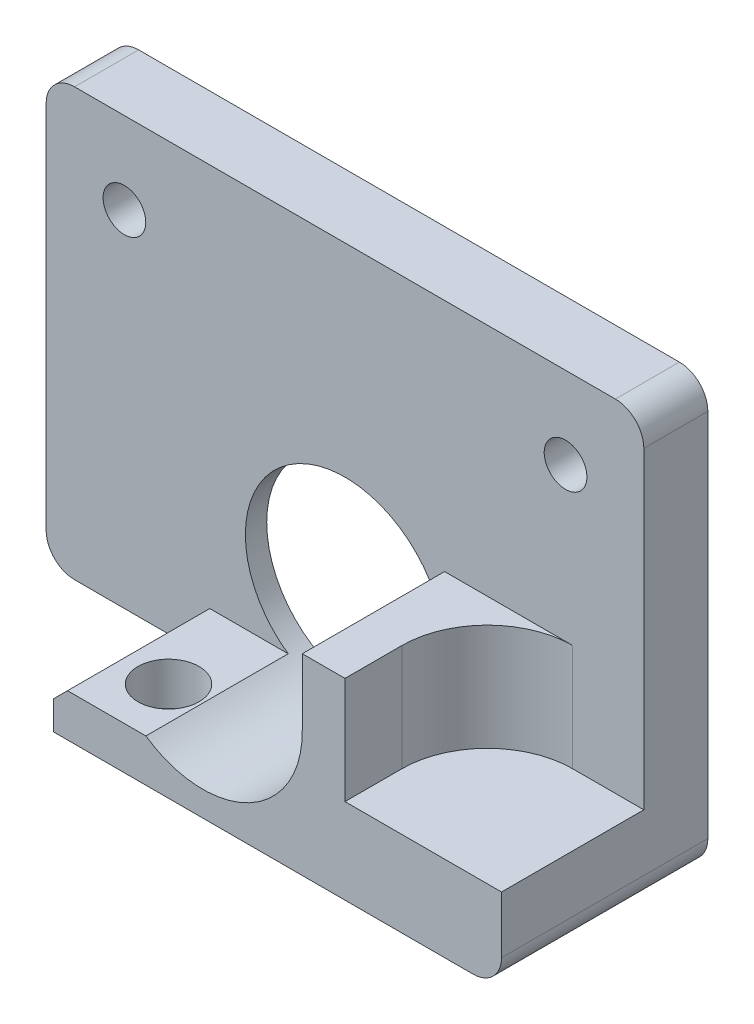
ISO-10303-21;
HEADER;
FILE_DESCRIPTION(('STEP AP214'),'2;1');
FILE_NAME('part.step','',(''),(''),'','','');
FILE_SCHEMA(('AUTOMOTIVE_DESIGN { 1 0 10303 214 1 1 1 1 }'));
ENDSEC;
DATA;
#1=APPLICATION_CONTEXT('core data for automotive mechanical design processes');
#2=APPLICATION_PROTOCOL_DEFINITION('international standard','automotive_design',2000,#1);
#3=PRODUCT_CONTEXT('',#1,'mechanical');
#4=PRODUCT('Part','Part','',(#3));
#5=PRODUCT_RELATED_PRODUCT_CATEGORY('part','',(#4));
#6=PRODUCT_DEFINITION_FORMATION('','',#4);
#7=PRODUCT_DEFINITION_CONTEXT('part definition',#1,'design');
#8=PRODUCT_DEFINITION('design','',#6,#7);
#9=PRODUCT_DEFINITION_SHAPE('','',#8);
#10=(LENGTH_UNIT() NAMED_UNIT(*) SI_UNIT(.MILLI.,.METRE.));
#11=(NAMED_UNIT(*) PLANE_ANGLE_UNIT() SI_UNIT($,.RADIAN.));
#12=(NAMED_UNIT(*) SI_UNIT($,.STERADIAN.) SOLID_ANGLE_UNIT());
#13=UNCERTAINTY_MEASURE_WITH_UNIT(LENGTH_MEASURE(1.E-05),#10,'distance_accuracy_value','');
#14=(GEOMETRIC_REPRESENTATION_CONTEXT(3) GLOBAL_UNCERTAINTY_ASSIGNED_CONTEXT((#13)) GLOBAL_UNIT_ASSIGNED_CONTEXT((#10,
#11,#12)) REPRESENTATION_CONTEXT('',''));
#15=CARTESIAN_POINT('',(0.,0.,0.));
#16=DIRECTION('',(0.,0.,1.));
#17=DIRECTION('',(1.,0.,0.));
#18=AXIS2_PLACEMENT_3D('',#15,#16,#17);
#19=CARTESIAN_POINT('',(0.,0.,4.5));
#20=DIRECTION('',(0.,0.,-1.));
#21=DIRECTION('',(-1.,0.,0.));
#22=AXIS2_PLACEMENT_3D('',#19,#20,#21);
#23=PLANE('',#22);
#24=CARTESIAN_POINT('',(-15.5,9.24999999999987,4.5));
#25=DIRECTION('',(0.,0.,1.));
#26=DIRECTION('',(1.,0.,0.));
#27=AXIS2_PLACEMENT_3D('',#24,#25,#26);
#28=CIRCLE('',#27,1.5);
#29=CARTESIAN_POINT('',(-14.,9.24999999999987,4.5));
#30=VERTEX_POINT('',#29);
#31=EDGE_CURVE('E391',#30,#30,#28,.T.);
#32=ORIENTED_EDGE('',*,*,#31,.F.);
#33=EDGE_LOOP('',(#32));
#34=FACE_BOUND('',#33,.T.);
#35=CARTESIAN_POINT('',(15.5,9.24999999999987,4.5));
#36=DIRECTION('',(0.,0.,1.));
#37=DIRECTION('',(1.,0.,0.));
#38=AXIS2_PLACEMENT_3D('',#35,#36,#37);
#39=CIRCLE('',#38,1.5);
#40=CARTESIAN_POINT('',(17.,9.24999999999987,4.5));
#41=VERTEX_POINT('',#40);
#42=EDGE_CURVE('E398',#41,#41,#39,.T.);
#43=ORIENTED_EDGE('',*,*,#42,.F.);
#44=EDGE_LOOP('',(#43));
#45=FACE_BOUND('',#44,.T.);
#46=DIRECTION('',(0.,1.,0.));
#47=VECTOR('',#46,1.);
#48=CARTESIAN_POINT('',(21.,-15.,4.5));
#49=LINE('',#48,#47);
#50=CARTESIAN_POINT('',(21.,-9.,4.5));
#51=VERTEX_POINT('',#50);
#52=CARTESIAN_POINT('',(21.,13.,4.5));
#53=VERTEX_POINT('',#52);
#54=EDGE_CURVE('E262',#51,#53,#49,.T.);
#55=ORIENTED_EDGE('',*,*,#54,.T.);
#56=CARTESIAN_POINT('',(19.,13.,4.5));
#57=DIRECTION('',(0.,0.,-1.));
#58=DIRECTION('',(-1.,0.,0.));
#59=AXIS2_PLACEMENT_3D('',#56,#57,#58);
#60=CIRCLE('',#59,2.);
#61=CARTESIAN_POINT('',(19.,15.,4.5));
#62=VERTEX_POINT('',#61);
#63=EDGE_CURVE('E367',#53,#62,#60,.F.);
#64=ORIENTED_EDGE('',*,*,#63,.T.);
#65=DIRECTION('',(-1.,0.,0.));
#66=VECTOR('',#65,1.);
#67=CARTESIAN_POINT('',(-21.,15.,4.5));
#68=LINE('',#67,#66);
#69=CARTESIAN_POINT('',(-19.,15.,4.5));
#70=VERTEX_POINT('',#69);
#71=EDGE_CURVE('E266',#62,#70,#68,.T.);
#72=ORIENTED_EDGE('',*,*,#71,.T.);
#73=CARTESIAN_POINT('',(-19.,13.,4.5));
#74=DIRECTION('',(0.,0.,-1.));
#75=DIRECTION('',(-1.,0.,0.));
#76=AXIS2_PLACEMENT_3D('',#73,#74,#75);
#77=CIRCLE('',#76,2.);
#78=CARTESIAN_POINT('',(-21.,13.,4.5));
#79=VERTEX_POINT('',#78);
#80=EDGE_CURVE('E361',#70,#79,#77,.F.);
#81=ORIENTED_EDGE('',*,*,#80,.T.);
#82=DIRECTION('',(0.,-1.,0.));
#83=VECTOR('',#82,1.);
#84=CARTESIAN_POINT('',(-21.,-15.,4.5));
#85=LINE('',#84,#83);
#86=CARTESIAN_POINT('',(-21.,-13.,4.5));
#87=VERTEX_POINT('',#86);
#88=EDGE_CURVE('E271',#79,#87,#85,.T.);
#89=ORIENTED_EDGE('',*,*,#88,.T.);
#90=CARTESIAN_POINT('',(-19.,-13.,4.5));
#91=DIRECTION('',(0.,0.,-1.));
#92=DIRECTION('',(-1.,0.,0.));
#93=AXIS2_PLACEMENT_3D('',#90,#91,#92);
#94=CIRCLE('',#93,2.);
#95=CARTESIAN_POINT('',(-19.,-15.,4.5));
#96=VERTEX_POINT('',#95);
#97=EDGE_CURVE('E364',#87,#96,#94,.F.);
#98=ORIENTED_EDGE('',*,*,#97,.T.);
#99=DIRECTION('',(1.,0.,0.));
#100=VECTOR('',#99,1.);
#101=CARTESIAN_POINT('',(-21.,-15.,4.5));
#102=LINE('',#101,#100);
#103=CARTESIAN_POINT('',(-10.5,-15.,4.5));
#104=VERTEX_POINT('',#103);
#105=EDGE_CURVE('E275',#96,#104,#102,.T.);
#106=ORIENTED_EDGE('',*,*,#105,.T.);
#107=DIRECTION('',(0.,-1.,0.));
#108=VECTOR('',#107,1.);
#109=CARTESIAN_POINT('',(-10.5,-12.,4.5));
#110=LINE('',#109,#108);
#111=CARTESIAN_POINT('',(-10.5,-13.,4.5));
#112=VERTEX_POINT('',#111);
#113=EDGE_CURVE('E238',#112,#104,#110,.T.);
#114=ORIENTED_EDGE('',*,*,#113,.F.);
#115=DIRECTION('',(-0.707106781186552,-0.707106781186543,0.));
#116=VECTOR('',#115,1.);
#117=CARTESIAN_POINT('',(1.25000000000007,-1.25000000000009,4.5));
#118=LINE('',#117,#116);
#119=CARTESIAN_POINT('',(-9.49999999999999,-12.,4.5));
#120=VERTEX_POINT('',#119);
#121=EDGE_CURVE('E11',#112,#120,#118,.F.);
#122=ORIENTED_EDGE('',*,*,#121,.T.);
#123=DIRECTION('',(-1.,0.,0.));
#124=VECTOR('',#123,1.);
#125=CARTESIAN_POINT('',(7.00000000000001,-12.,4.5));
#126=LINE('',#125,#124);
#127=CARTESIAN_POINT('',(-3.99217985566783,-12.,4.5));
#128=VERTEX_POINT('',#127);
#129=EDGE_CURVE('E235',#128,#120,#126,.T.);
#130=ORIENTED_EDGE('',*,*,#129,.F.);
#131=CARTESIAN_POINT('',(0.,-6.25,4.5));
#132=DIRECTION('',(0.,0.,-1.));
#133=DIRECTION('',(-1.,0.,0.));
#134=AXIS2_PLACEMENT_3D('',#131,#132,#133);
#135=CIRCLE('',#134,7.);
#136=CARTESIAN_POINT('',(6.99879618184396,-6.12018472737596,4.5));
#137=VERTEX_POINT('',#136);
#138=EDGE_CURVE('E189',#128,#137,#135,.T.);
#139=ORIENTED_EDGE('',*,*,#138,.T.);
#140=CARTESIAN_POINT('',(1.00000000000001,-6.,4.5));
#141=DIRECTION('',(0.,0.,-1.));
#142=DIRECTION('',(-1.,0.,0.));
#143=AXIS2_PLACEMENT_3D('',#140,#141,#142);
#144=CIRCLE('',#143,6.);
#145=CARTESIAN_POINT('',(7.00000000000001,-6.,4.5));
#146=VERTEX_POINT('',#145);
#147=EDGE_CURVE('E297',#137,#146,#144,.F.);
#148=ORIENTED_EDGE('',*,*,#147,.T.);
#149=DIRECTION('',(0.,-1.,0.));
#150=VECTOR('',#149,1.);
#151=CARTESIAN_POINT('',(7.00000000000001,-1.5,4.5));
#152=LINE('',#151,#150);
#153=CARTESIAN_POINT('',(7.00000000000001,-1.5,4.5));
#154=VERTEX_POINT('',#153);
#155=EDGE_CURVE('E231',#154,#146,#152,.T.);
#156=ORIENTED_EDGE('',*,*,#155,.F.);
#157=DIRECTION('',(-1.,0.,0.));
#158=VECTOR('',#157,1.);
#159=CARTESIAN_POINT('',(10.,-1.5,4.5));
#160=LINE('',#159,#158);
#161=CARTESIAN_POINT('',(16.,-1.5,4.5));
#162=VERTEX_POINT('',#161);
#163=EDGE_CURVE('E226',#162,#154,#160,.T.);
#164=ORIENTED_EDGE('',*,*,#163,.F.);
#165=DIRECTION('',(0.,1.,0.));
#166=VECTOR('',#165,1.);
#167=CARTESIAN_POINT('',(16.,-9.,4.5));
#168=LINE('',#167,#166);
#169=CARTESIAN_POINT('',(16.,-9.,4.5));
#170=VERTEX_POINT('',#169);
#171=EDGE_CURVE('E300',#162,#170,#168,.F.);
#172=ORIENTED_EDGE('',*,*,#171,.T.);
#173=DIRECTION('',(-1.,0.,0.));
#174=VECTOR('',#173,1.);
#175=CARTESIAN_POINT('',(21.,-9.,4.5));
#176=LINE('',#175,#174);
#177=EDGE_CURVE('E222',#51,#170,#176,.T.);
#178=ORIENTED_EDGE('',*,*,#177,.F.);
#179=EDGE_LOOP('',(#55,#64,#72,#81,#89,#98,#106,#114,#122,#130,#139,#148,#156,#164,#172,#178));
#180=FACE_BOUND('',#179,.T.);
#181=ADVANCED_FACE('F38',(#34,#45,#180),#23,.F.);
#182=CARTESIAN_POINT('',(21.,-15.,4.5));
#183=DIRECTION('',(-1.,0.,0.));
#184=DIRECTION('',(0.,0.,1.));
#185=AXIS2_PLACEMENT_3D('',#182,#183,#184);
#186=PLANE('',#185);
#187=DIRECTION('',(0.,1.,0.));
#188=VECTOR('',#187,1.);
#189=CARTESIAN_POINT('',(21.,-15.,14.5));
#190=LINE('',#189,#188);
#191=CARTESIAN_POINT('',(21.,-13.,14.5));
#192=VERTEX_POINT('',#191);
#193=CARTESIAN_POINT('',(21.,-9.,14.5));
#194=VERTEX_POINT('',#193);
#195=EDGE_CURVE('E241',#192,#194,#190,.T.);
#196=ORIENTED_EDGE('',*,*,#195,.F.);
#197=DIRECTION('',(0.,0.,-1.));
#198=VECTOR('',#197,1.);
#199=CARTESIAN_POINT('',(21.,-13.,4.5));
#200=LINE('',#199,#198);
#201=CARTESIAN_POINT('',(21.,-13.,0.));
#202=VERTEX_POINT('',#201);
#203=EDGE_CURVE('E328',#192,#202,#200,.T.);
#204=ORIENTED_EDGE('',*,*,#203,.T.);
#205=DIRECTION('',(0.,1.,0.));
#206=VECTOR('',#205,1.);
#207=CARTESIAN_POINT('',(21.,-15.,0.));
#208=LINE('',#207,#206);
#209=CARTESIAN_POINT('',(21.,13.,0.));
#210=VERTEX_POINT('',#209);
#211=EDGE_CURVE('E261',#202,#210,#208,.T.);
#212=ORIENTED_EDGE('',*,*,#211,.T.);
#213=DIRECTION('',(0.,0.,-1.));
#214=VECTOR('',#213,1.);
#215=CARTESIAN_POINT('',(21.,13.,4.5));
#216=LINE('',#215,#214);
#217=EDGE_CURVE('E321',#210,#53,#216,.F.);
#218=ORIENTED_EDGE('',*,*,#217,.T.);
#219=ORIENTED_EDGE('',*,*,#54,.F.);
#220=DIRECTION('',(0.,0.,-1.));
#221=VECTOR('',#220,1.);
#222=CARTESIAN_POINT('',(21.,-9.,14.5));
#223=LINE('',#222,#221);
#224=EDGE_CURVE('E257',#194,#51,#223,.T.);
#225=ORIENTED_EDGE('',*,*,#224,.F.);
#226=EDGE_LOOP('',(#196,#204,#212,#218,#219,#225));
#227=FACE_BOUND('',#226,.T.);
#228=ADVANCED_FACE('F463',(#227),#186,.F.);
#229=CARTESIAN_POINT('',(-21.,15.,4.5));
#230=DIRECTION('',(0.,-1.,0.));
#231=DIRECTION('',(0.,0.,-1.));
#232=AXIS2_PLACEMENT_3D('',#229,#230,#231);
#233=PLANE('',#232);
#234=ORIENTED_EDGE('',*,*,#71,.F.);
#235=DIRECTION('',(0.,0.,-1.));
#236=VECTOR('',#235,1.);
#237=CARTESIAN_POINT('',(19.,15.,4.5));
#238=LINE('',#237,#236);
#239=CARTESIAN_POINT('',(19.,15.,0.));
#240=VERTEX_POINT('',#239);
#241=EDGE_CURVE('E357',#62,#240,#238,.T.);
#242=ORIENTED_EDGE('',*,*,#241,.T.);
#243=DIRECTION('',(-1.,0.,0.));
#244=VECTOR('',#243,1.);
#245=CARTESIAN_POINT('',(-21.,15.,0.));
#246=LINE('',#245,#244);
#247=CARTESIAN_POINT('',(-19.,15.,0.));
#248=VERTEX_POINT('',#247);
#249=EDGE_CURVE('E283',#240,#248,#246,.T.);
#250=ORIENTED_EDGE('',*,*,#249,.T.);
#251=DIRECTION('',(0.,0.,-1.));
#252=VECTOR('',#251,1.);
#253=CARTESIAN_POINT('',(-19.,15.,4.5));
#254=LINE('',#253,#252);
#255=EDGE_CURVE('E354',#248,#70,#254,.F.);
#256=ORIENTED_EDGE('',*,*,#255,.T.);
#257=EDGE_LOOP('',(#234,#242,#250,#256));
#258=FACE_BOUND('',#257,.T.);
#259=ADVANCED_FACE('F476',(#258),#233,.F.);
#260=CARTESIAN_POINT('',(-21.,-15.,4.5));
#261=DIRECTION('',(1.,0.,0.));
#262=DIRECTION('',(0.,0.,-1.));
#263=AXIS2_PLACEMENT_3D('',#260,#261,#262);
#264=PLANE('',#263);
#265=DIRECTION('',(0.,-1.,0.));
#266=VECTOR('',#265,1.);
#267=CARTESIAN_POINT('',(-21.,-15.,0.));
#268=LINE('',#267,#266);
#269=CARTESIAN_POINT('',(-21.,13.,0.));
#270=VERTEX_POINT('',#269);
#271=CARTESIAN_POINT('',(-21.,-13.,0.));
#272=VERTEX_POINT('',#271);
#273=EDGE_CURVE('E287',#270,#272,#268,.T.);
#274=ORIENTED_EDGE('',*,*,#273,.T.);
#275=DIRECTION('',(0.,0.,-1.));
#276=VECTOR('',#275,1.);
#277=CARTESIAN_POINT('',(-21.,-13.,4.5));
#278=LINE('',#277,#276);
#279=EDGE_CURVE('E374',#272,#87,#278,.F.);
#280=ORIENTED_EDGE('',*,*,#279,.T.);
#281=ORIENTED_EDGE('',*,*,#88,.F.);
#282=DIRECTION('',(0.,0.,-1.));
#283=VECTOR('',#282,1.);
#284=CARTESIAN_POINT('',(-21.,13.,4.5));
#285=LINE('',#284,#283);
#286=EDGE_CURVE('E370',#79,#270,#285,.T.);
#287=ORIENTED_EDGE('',*,*,#286,.T.);
#288=EDGE_LOOP('',(#274,#280,#281,#287));
#289=FACE_BOUND('',#288,.T.);
#290=ADVANCED_FACE('F485',(#289),#264,.F.);
#291=CARTESIAN_POINT('',(-21.,-15.,4.5));
#292=DIRECTION('',(0.,1.,0.));
#293=DIRECTION('',(0.,0.,1.));
#294=AXIS2_PLACEMENT_3D('',#291,#292,#293);
#295=PLANE('',#294);
#296=CARTESIAN_POINT('',(-6.34999999999999,-15.,10.55));
#297=DIRECTION('',(0.,-1.,0.));
#298=DIRECTION('',(0.,0.,-1.));
#299=AXIS2_PLACEMENT_3D('',#296,#297,#298);
#300=CIRCLE('',#299,2.15);
#301=CARTESIAN_POINT('',(-6.34999999999999,-15.,8.4));
#302=VERTEX_POINT('',#301);
#303=EDGE_CURVE('E387',#302,#302,#300,.T.);
#304=ORIENTED_EDGE('',*,*,#303,.F.);
#305=EDGE_LOOP('',(#304));
#306=FACE_BOUND('',#305,.T.);
#307=DIRECTION('',(1.,0.,0.));
#308=VECTOR('',#307,1.);
#309=CARTESIAN_POINT('',(-21.,-15.,0.));
#310=LINE('',#309,#308);
#311=CARTESIAN_POINT('',(7.07106781186548,-15.,0.));
#312=VERTEX_POINT('',#311);
#313=CARTESIAN_POINT('',(19.,-15.,0.));
#314=VERTEX_POINT('',#313);
#315=EDGE_CURVE('E291',#312,#314,#310,.T.);
#316=ORIENTED_EDGE('',*,*,#315,.T.);
#317=DIRECTION('',(0.,0.,-1.));
#318=VECTOR('',#317,1.);
#319=CARTESIAN_POINT('',(19.,-15.,4.5));
#320=LINE('',#319,#318);
#321=CARTESIAN_POINT('',(19.,-15.,14.5));
#322=VERTEX_POINT('',#321);
#323=EDGE_CURVE('E348',#314,#322,#320,.F.);
#324=ORIENTED_EDGE('',*,*,#323,.T.);
#325=DIRECTION('',(1.,0.,0.));
#326=VECTOR('',#325,1.);
#327=CARTESIAN_POINT('',(-10.5,-15.,14.5));
#328=LINE('',#327,#326);
#329=CARTESIAN_POINT('',(-10.5,-15.,14.5));
#330=VERTEX_POINT('',#329);
#331=EDGE_CURVE('E212',#330,#322,#328,.T.);
#332=ORIENTED_EDGE('',*,*,#331,.F.);
#333=DIRECTION('',(0.,0.,-1.));
#334=VECTOR('',#333,1.);
#335=CARTESIAN_POINT('',(-10.5,-15.,14.5));
#336=LINE('',#335,#334);
#337=EDGE_CURVE('E221',#330,#104,#336,.T.);
#338=ORIENTED_EDGE('',*,*,#337,.T.);
#339=ORIENTED_EDGE('',*,*,#105,.F.);
#340=DIRECTION('',(0.,0.,-1.));
#341=VECTOR('',#340,1.);
#342=CARTESIAN_POINT('',(-19.,-15.,4.5));
#343=LINE('',#342,#341);
#344=CARTESIAN_POINT('',(-19.,-15.,0.));
#345=VERTEX_POINT('',#344);
#346=EDGE_CURVE('E344',#96,#345,#343,.T.);
#347=ORIENTED_EDGE('',*,*,#346,.T.);
#348=CARTESIAN_POINT('',(-7.07106781186548,-15.,0.));
#349=VERTEX_POINT('',#348);
#350=EDGE_CURVE('E267',#345,#349,#310,.T.);
#351=ORIENTED_EDGE('',*,*,#350,.T.);
#352=DIRECTION('',(0.,0.,-1.));
#353=VECTOR('',#352,1.);
#354=CARTESIAN_POINT('',(-7.07106781186548,-15.,3.));
#355=LINE('',#354,#353);
#356=CARTESIAN_POINT('',(-7.07106781186548,-15.,3.));
#357=VERTEX_POINT('',#356);
#358=EDGE_CURVE('E416',#349,#357,#355,.F.);
#359=ORIENTED_EDGE('',*,*,#358,.T.);
#360=DIRECTION('',(-1.,0.,0.));
#361=VECTOR('',#360,1.);
#362=CARTESIAN_POINT('',(-21.,-15.,3.));
#363=LINE('',#362,#361);
#364=CARTESIAN_POINT('',(7.07106781186548,-15.,3.));
#365=VERTEX_POINT('',#364);
#366=EDGE_CURVE('E318',#365,#357,#363,.T.);
#367=ORIENTED_EDGE('',*,*,#366,.F.);
#368=DIRECTION('',(0.,0.,-1.));
#369=VECTOR('',#368,1.);
#370=CARTESIAN_POINT('',(7.07106781186548,-15.,3.));
#371=LINE('',#370,#369);
#372=EDGE_CURVE('E227',#365,#312,#371,.T.);
#373=ORIENTED_EDGE('',*,*,#372,.T.);
#374=EDGE_LOOP('',(#316,#324,#332,#338,#339,#347,#351,#359,#367,#373));
#375=FACE_BOUND('',#374,.T.);
#376=ADVANCED_FACE('F454',(#306,#375),#295,.F.);
#377=CARTESIAN_POINT('',(0.,0.,0.));
#378=DIRECTION('',(0.,0.,-1.));
#379=DIRECTION('',(-1.,0.,0.));
#380=AXIS2_PLACEMENT_3D('',#377,#378,#379);
#381=PLANE('',#380);
#382=CARTESIAN_POINT('',(-15.5,9.24999999999987,0.));
#383=DIRECTION('',(0.,0.,-1.));
#384=DIRECTION('',(-1.,0.,0.));
#385=AXIS2_PLACEMENT_3D('',#382,#383,#384);
#386=CIRCLE('',#385,1.5);
#387=CARTESIAN_POINT('',(-17.0000000000001,9.24999999999987,0.));
#388=VERTEX_POINT('',#387);
#389=EDGE_CURVE('E42',#388,#388,#386,.T.);
#390=ORIENTED_EDGE('',*,*,#389,.F.);
#391=EDGE_LOOP('',(#390));
#392=FACE_BOUND('',#391,.T.);
#393=CARTESIAN_POINT('',(15.5,9.24999999999987,0.));
#394=DIRECTION('',(0.,0.,-1.));
#395=DIRECTION('',(-1.,0.,0.));
#396=AXIS2_PLACEMENT_3D('',#393,#394,#395);
#397=CIRCLE('',#396,1.5);
#398=CARTESIAN_POINT('',(14.,9.24999999999987,0.));
#399=VERTEX_POINT('',#398);
#400=EDGE_CURVE('E388',#399,#399,#397,.T.);
#401=ORIENTED_EDGE('',*,*,#400,.F.);
#402=EDGE_LOOP('',(#401));
#403=FACE_BOUND('',#402,.T.);
#404=ORIENTED_EDGE('',*,*,#211,.F.);
#405=CARTESIAN_POINT('',(19.,-13.,0.));
#406=DIRECTION('',(0.,0.,-1.));
#407=DIRECTION('',(-1.,0.,0.));
#408=AXIS2_PLACEMENT_3D('',#405,#406,#407);
#409=CIRCLE('',#408,2.);
#410=EDGE_CURVE('E341',#202,#314,#409,.T.);
#411=ORIENTED_EDGE('',*,*,#410,.T.);
#412=ORIENTED_EDGE('',*,*,#315,.F.);
#413=CARTESIAN_POINT('',(0.,-6.25,0.));
#414=DIRECTION('',(0.,0.,-1.));
#415=DIRECTION('',(-1.,0.,0.));
#416=AXIS2_PLACEMENT_3D('',#413,#414,#415);
#417=CIRCLE('',#416,11.25);
#418=EDGE_CURVE('E315',#349,#312,#417,.T.);
#419=ORIENTED_EDGE('',*,*,#418,.F.);
#420=ORIENTED_EDGE('',*,*,#350,.F.);
#421=CARTESIAN_POINT('',(-19.,-13.,0.));
#422=DIRECTION('',(0.,0.,-1.));
#423=DIRECTION('',(-1.,0.,0.));
#424=AXIS2_PLACEMENT_3D('',#421,#422,#423);
#425=CIRCLE('',#424,2.);
#426=EDGE_CURVE('E335',#345,#272,#425,.T.);
#427=ORIENTED_EDGE('',*,*,#426,.T.);
#428=ORIENTED_EDGE('',*,*,#273,.F.);
#429=CARTESIAN_POINT('',(-19.,13.,0.));
#430=DIRECTION('',(0.,0.,-1.));
#431=DIRECTION('',(-1.,0.,0.));
#432=AXIS2_PLACEMENT_3D('',#429,#430,#431);
#433=CIRCLE('',#432,2.);
#434=EDGE_CURVE('E332',#270,#248,#433,.T.);
#435=ORIENTED_EDGE('',*,*,#434,.T.);
#436=ORIENTED_EDGE('',*,*,#249,.F.);
#437=CARTESIAN_POINT('',(19.,13.,0.));
#438=DIRECTION('',(0.,0.,-1.));
#439=DIRECTION('',(-1.,0.,0.));
#440=AXIS2_PLACEMENT_3D('',#437,#438,#439);
#441=CIRCLE('',#440,2.);
#442=EDGE_CURVE('E338',#240,#210,#441,.T.);
#443=ORIENTED_EDGE('',*,*,#442,.T.);
#444=EDGE_LOOP('',(#404,#411,#412,#419,#420,#427,#428,#435,#436,#443));
#445=FACE_BOUND('',#444,.T.);
#446=ADVANCED_FACE('F467',(#392,#403,#445),#381,.T.);
#447=CARTESIAN_POINT('',(21.,-9.,14.5));
#448=DIRECTION('',(0.,-1.,0.));
#449=DIRECTION('',(1.,0.,0.));
#450=AXIS2_PLACEMENT_3D('',#447,#448,#449);
#451=PLANE('',#450);
#452=ORIENTED_EDGE('',*,*,#177,.T.);
#453=CARTESIAN_POINT('',(16.,-9.,10.5));
#454=DIRECTION('',(0.,-1.,0.));
#455=DIRECTION('',(1.,0.,0.));
#456=AXIS2_PLACEMENT_3D('',#453,#454,#455);
#457=CIRCLE('',#456,6.);
#458=CARTESIAN_POINT('',(10.,-9.,10.5));
#459=VERTEX_POINT('',#458);
#460=EDGE_CURVE('E303',#170,#459,#457,.F.);
#461=ORIENTED_EDGE('',*,*,#460,.T.);
#462=DIRECTION('',(0.,0.,-1.));
#463=VECTOR('',#462,1.);
#464=CARTESIAN_POINT('',(10.,-9.,14.5));
#465=LINE('',#464,#463);
#466=CARTESIAN_POINT('',(10.,-9.,14.5));
#467=VERTEX_POINT('',#466);
#468=EDGE_CURVE('E253',#467,#459,#465,.T.);
#469=ORIENTED_EDGE('',*,*,#468,.F.);
#470=DIRECTION('',(-1.,0.,0.));
#471=VECTOR('',#470,1.);
#472=CARTESIAN_POINT('',(21.,-9.,14.5));
#473=LINE('',#472,#471);
#474=EDGE_CURVE('E425',#194,#467,#473,.T.);
#475=ORIENTED_EDGE('',*,*,#474,.F.);
#476=ORIENTED_EDGE('',*,*,#224,.T.);
#477=EDGE_LOOP('',(#452,#461,#469,#475,#476));
#478=FACE_BOUND('',#477,.T.);
#479=ADVANCED_FACE('F525',(#478),#451,.F.);
#480=CARTESIAN_POINT('',(10.,-9.,14.5));
#481=DIRECTION('',(-1.,0.,0.));
#482=DIRECTION('',(0.,0.,1.));
#483=AXIS2_PLACEMENT_3D('',#480,#481,#482);
#484=PLANE('',#483);
#485=ORIENTED_EDGE('',*,*,#468,.T.);
#486=DIRECTION('',(0.,1.,0.));
#487=VECTOR('',#486,1.);
#488=CARTESIAN_POINT('',(10.,-1.5,10.5));
#489=LINE('',#488,#487);
#490=CARTESIAN_POINT('',(10.,-1.5,10.5));
#491=VERTEX_POINT('',#490);
#492=EDGE_CURVE('E279',#459,#491,#489,.T.);
#493=ORIENTED_EDGE('',*,*,#492,.T.);
#494=DIRECTION('',(0.,0.,-1.));
#495=VECTOR('',#494,1.);
#496=CARTESIAN_POINT('',(10.,-1.5,14.5));
#497=LINE('',#496,#495);
#498=CARTESIAN_POINT('',(10.,-1.5,14.5));
#499=VERTEX_POINT('',#498);
#500=EDGE_CURVE('E249',#499,#491,#497,.T.);
#501=ORIENTED_EDGE('',*,*,#500,.F.);
#502=DIRECTION('',(0.,1.,0.));
#503=VECTOR('',#502,1.);
#504=CARTESIAN_POINT('',(10.,-9.,14.5));
#505=LINE('',#504,#503);
#506=EDGE_CURVE('E428',#467,#499,#505,.T.);
#507=ORIENTED_EDGE('',*,*,#506,.F.);
#508=EDGE_LOOP('',(#485,#493,#501,#507));
#509=FACE_BOUND('',#508,.T.);
#510=ADVANCED_FACE('F661',(#509),#484,.F.);
#511=CARTESIAN_POINT('',(10.,-1.5,14.5));
#512=DIRECTION('',(0.,-1.,0.));
#513=DIRECTION('',(1.,0.,0.));
#514=AXIS2_PLACEMENT_3D('',#511,#512,#513);
#515=PLANE('',#514);
#516=ORIENTED_EDGE('',*,*,#163,.T.);
#517=DIRECTION('',(0.,0.,-1.));
#518=VECTOR('',#517,1.);
#519=CARTESIAN_POINT('',(7.00000000000001,-1.5,14.5));
#520=LINE('',#519,#518);
#521=CARTESIAN_POINT('',(7.00000000000001,-1.5,14.5));
#522=VERTEX_POINT('',#521);
#523=EDGE_CURVE('E245',#522,#154,#520,.T.);
#524=ORIENTED_EDGE('',*,*,#523,.F.);
#525=DIRECTION('',(-1.,0.,0.));
#526=VECTOR('',#525,1.);
#527=CARTESIAN_POINT('',(10.,-1.5,14.5));
#528=LINE('',#527,#526);
#529=EDGE_CURVE('E214',#499,#522,#528,.T.);
#530=ORIENTED_EDGE('',*,*,#529,.F.);
#531=ORIENTED_EDGE('',*,*,#500,.T.);
#532=CARTESIAN_POINT('',(16.,-1.5,10.5));
#533=DIRECTION('',(0.,-1.,0.));
#534=DIRECTION('',(1.,0.,0.));
#535=AXIS2_PLACEMENT_3D('',#532,#533,#534);
#536=CIRCLE('',#535,6.);
#537=EDGE_CURVE('E309',#491,#162,#536,.T.);
#538=ORIENTED_EDGE('',*,*,#537,.T.);
#539=EDGE_LOOP('',(#516,#524,#530,#531,#538));
#540=FACE_BOUND('',#539,.T.);
#541=ADVANCED_FACE('F437',(#540),#515,.F.);
#542=CARTESIAN_POINT('',(7.00000000000001,-1.5,14.5));
#543=DIRECTION('',(1.,0.,0.));
#544=DIRECTION('',(0.,1.,0.));
#545=AXIS2_PLACEMENT_3D('',#542,#543,#544);
#546=PLANE('',#545);
#547=ORIENTED_EDGE('',*,*,#155,.T.);
#548=DIRECTION('',(0.,0.,-1.));
#549=VECTOR('',#548,1.);
#550=CARTESIAN_POINT('',(7.00000000000001,-6.,14.5));
#551=LINE('',#550,#549);
#552=CARTESIAN_POINT('',(7.00000000000001,-6.,14.5));
#553=VERTEX_POINT('',#552);
#554=EDGE_CURVE('E306',#146,#553,#551,.F.);
#555=ORIENTED_EDGE('',*,*,#554,.T.);
#556=DIRECTION('',(0.,-1.,0.));
#557=VECTOR('',#556,1.);
#558=CARTESIAN_POINT('',(7.00000000000001,-1.5,14.5));
#559=LINE('',#558,#557);
#560=EDGE_CURVE('E208',#522,#553,#559,.T.);
#561=ORIENTED_EDGE('',*,*,#560,.F.);
#562=ORIENTED_EDGE('',*,*,#523,.T.);
#563=EDGE_LOOP('',(#547,#555,#561,#562));
#564=FACE_BOUND('',#563,.T.);
#565=ADVANCED_FACE('F439',(#564),#546,.F.);
#566=CARTESIAN_POINT('',(7.00000000000001,-12.,14.5));
#567=DIRECTION('',(0.,-1.,0.));
#568=DIRECTION('',(1.,0.,0.));
#569=AXIS2_PLACEMENT_3D('',#566,#567,#568);
#570=PLANE('',#569);
#571=CARTESIAN_POINT('',(-6.34999999999999,-12.,10.55));
#572=DIRECTION('',(0.,-1.,0.));
#573=DIRECTION('',(1.,0.,0.));
#574=AXIS2_PLACEMENT_3D('',#571,#572,#573);
#575=CIRCLE('',#574,2.15);
#576=CARTESIAN_POINT('',(-4.19999999999999,-12.,10.55));
#577=VERTEX_POINT('',#576);
#578=EDGE_CURVE('E203',#577,#577,#575,.T.);
#579=ORIENTED_EDGE('',*,*,#578,.T.);
#580=EDGE_LOOP('',(#579));
#581=FACE_BOUND('',#580,.T.);
#582=ORIENTED_EDGE('',*,*,#129,.T.);
#583=DIRECTION('',(0.,0.,1.));
#584=VECTOR('',#583,1.);
#585=CARTESIAN_POINT('',(-9.49999999999999,-12.,14.5));
#586=LINE('',#585,#584);
#587=CARTESIAN_POINT('',(-9.49999999999999,-12.,14.5));
#588=VERTEX_POINT('',#587);
#589=EDGE_CURVE('E61',#120,#588,#586,.T.);
#590=ORIENTED_EDGE('',*,*,#589,.T.);
#591=DIRECTION('',(-1.,0.,0.));
#592=VECTOR('',#591,1.);
#593=CARTESIAN_POINT('',(7.00000000000001,-12.,14.5));
#594=LINE('',#593,#592);
#595=CARTESIAN_POINT('',(-3.99217985566783,-12.,14.5));
#596=VERTEX_POINT('',#595);
#597=EDGE_CURVE('E196',#596,#588,#594,.T.);
#598=ORIENTED_EDGE('',*,*,#597,.F.);
#599=DIRECTION('',(0.,0.,-1.));
#600=VECTOR('',#599,1.);
#601=CARTESIAN_POINT('',(-3.99217985566783,-12.,14.5));
#602=LINE('',#601,#600);
#603=EDGE_CURVE('E183',#596,#128,#602,.T.);
#604=ORIENTED_EDGE('',*,*,#603,.T.);
#605=EDGE_LOOP('',(#582,#590,#598,#604));
#606=FACE_BOUND('',#605,.T.);
#607=ADVANCED_FACE('F205',(#581,#606),#570,.F.);
#608=CARTESIAN_POINT('',(-10.5,-12.,14.5));
#609=DIRECTION('',(1.,0.,0.));
#610=DIRECTION('',(0.,0.,-1.));
#611=AXIS2_PLACEMENT_3D('',#608,#609,#610);
#612=PLANE('',#611);
#613=DIRECTION('',(0.,-1.,0.));
#614=VECTOR('',#613,1.);
#615=CARTESIAN_POINT('',(-10.5,-12.,14.5));
#616=LINE('',#615,#614);
#617=CARTESIAN_POINT('',(-10.5,-13.,14.5));
#618=VERTEX_POINT('',#617);
#619=EDGE_CURVE('E207',#618,#330,#616,.T.);
#620=ORIENTED_EDGE('',*,*,#619,.F.);
#621=DIRECTION('',(0.,0.,-1.));
#622=VECTOR('',#621,1.);
#623=CARTESIAN_POINT('',(-10.5,-13.,14.5));
#624=LINE('',#623,#622);
#625=EDGE_CURVE('E377',#618,#112,#624,.T.);
#626=ORIENTED_EDGE('',*,*,#625,.T.);
#627=ORIENTED_EDGE('',*,*,#113,.T.);
#628=ORIENTED_EDGE('',*,*,#337,.F.);
#629=EDGE_LOOP('',(#620,#626,#627,#628));
#630=FACE_BOUND('',#629,.T.);
#631=ADVANCED_FACE('F449',(#630),#612,.F.);
#632=CARTESIAN_POINT('',(0.,0.,14.5));
#633=DIRECTION('',(0.,0.,1.));
#634=DIRECTION('',(1.,0.,0.));
#635=AXIS2_PLACEMENT_3D('',#632,#633,#634);
#636=PLANE('',#635);
#637=ORIENTED_EDGE('',*,*,#597,.T.);
#638=DIRECTION('',(0.707106781186552,0.707106781186543,0.));
#639=VECTOR('',#638,1.);
#640=CARTESIAN_POINT('',(1.25000000000007,-1.25000000000009,14.5));
#641=LINE('',#640,#639);
#642=EDGE_CURVE('E48',#588,#618,#641,.F.);
#643=ORIENTED_EDGE('',*,*,#642,.T.);
#644=ORIENTED_EDGE('',*,*,#619,.T.);
#645=ORIENTED_EDGE('',*,*,#331,.T.);
#646=CARTESIAN_POINT('',(19.,-13.,14.5));
#647=DIRECTION('',(0.,0.,1.));
#648=DIRECTION('',(1.,0.,0.));
#649=AXIS2_PLACEMENT_3D('',#646,#647,#648);
#650=CIRCLE('',#649,2.);
#651=EDGE_CURVE('E351',#322,#192,#650,.T.);
#652=ORIENTED_EDGE('',*,*,#651,.T.);
#653=ORIENTED_EDGE('',*,*,#195,.T.);
#654=ORIENTED_EDGE('',*,*,#474,.T.);
#655=ORIENTED_EDGE('',*,*,#506,.T.);
#656=ORIENTED_EDGE('',*,*,#529,.T.);
#657=ORIENTED_EDGE('',*,*,#560,.T.);
#658=CARTESIAN_POINT('',(1.00000000000001,-6.,14.5));
#659=DIRECTION('',(0.,0.,1.));
#660=DIRECTION('',(1.,0.,0.));
#661=AXIS2_PLACEMENT_3D('',#658,#659,#660);
#662=CIRCLE('',#661,6.);
#663=CARTESIAN_POINT('',(6.99879618184396,-6.12018472737595,14.5));
#664=VERTEX_POINT('',#663);
#665=EDGE_CURVE('E200',#553,#664,#662,.F.);
#666=ORIENTED_EDGE('',*,*,#665,.T.);
#667=CARTESIAN_POINT('',(0.,-6.25,14.5));
#668=DIRECTION('',(0.,0.,-1.));
#669=DIRECTION('',(-1.,0.,0.));
#670=AXIS2_PLACEMENT_3D('',#667,#668,#669);
#671=CIRCLE('',#670,7.);
#672=EDGE_CURVE('E186',#664,#596,#671,.T.);
#673=ORIENTED_EDGE('',*,*,#672,.T.);
#674=EDGE_LOOP('',(#637,#643,#644,#645,#652,#653,#654,#655,#656,#657,#666,#673));
#675=FACE_BOUND('',#674,.T.);
#676=ADVANCED_FACE('F195',(#675),#636,.T.);
#677=CARTESIAN_POINT('',(16.,-9.,10.5));
#678=DIRECTION('',(0.,-1.,0.));
#679=DIRECTION('',(0.,0.,-1.));
#680=AXIS2_PLACEMENT_3D('',#677,#678,#679);
#681=CYLINDRICAL_SURFACE('',#680,6.);
#682=ORIENTED_EDGE('',*,*,#460,.F.);
#683=ORIENTED_EDGE('',*,*,#171,.F.);
#684=ORIENTED_EDGE('',*,*,#537,.F.);
#685=ORIENTED_EDGE('',*,*,#492,.F.);
#686=EDGE_LOOP('',(#682,#683,#684,#685));
#687=FACE_BOUND('',#686,.T.);
#688=ADVANCED_FACE('F509',(#687),#681,.F.);
#689=CARTESIAN_POINT('',(1.00000000000001,-6.,14.5));
#690=DIRECTION('',(0.,0.,1.));
#691=DIRECTION('',(1.,0.,0.));
#692=AXIS2_PLACEMENT_3D('',#689,#690,#691);
#693=CYLINDRICAL_SURFACE('',#692,6.);
#694=ORIENTED_EDGE('',*,*,#147,.F.);
#695=DIRECTION('',(0.,0.,-1.));
#696=VECTOR('',#695,1.);
#697=CARTESIAN_POINT('',(6.99879618184396,-6.12018472737595,7.25));
#698=LINE('',#697,#696);
#699=EDGE_CURVE('E325',#137,#664,#698,.F.);
#700=ORIENTED_EDGE('',*,*,#699,.T.);
#701=ORIENTED_EDGE('',*,*,#665,.F.);
#702=ORIENTED_EDGE('',*,*,#554,.F.);
#703=EDGE_LOOP('',(#694,#700,#701,#702));
#704=FACE_BOUND('',#703,.T.);
#705=ADVANCED_FACE('F443',(#704),#693,.F.);
#706=CARTESIAN_POINT('',(0.,-6.25,3.));
#707=DIRECTION('',(0.,0.,-1.));
#708=DIRECTION('',(-1.,0.,0.));
#709=AXIS2_PLACEMENT_3D('',#706,#707,#708);
#710=PLANE('',#709);
#711=CARTESIAN_POINT('',(0.,-6.25,3.));
#712=DIRECTION('',(0.,0.,-1.));
#713=DIRECTION('',(-1.,0.,0.));
#714=AXIS2_PLACEMENT_3D('',#711,#712,#713);
#715=CIRCLE('',#714,7.);
#716=CARTESIAN_POINT('',(-7.,-6.25,3.));
#717=VERTEX_POINT('',#716);
#718=EDGE_CURVE('E202',#717,#717,#715,.T.);
#719=ORIENTED_EDGE('',*,*,#718,.F.);
#720=EDGE_LOOP('',(#719));
#721=FACE_BOUND('',#720,.T.);
#722=ORIENTED_EDGE('',*,*,#366,.T.);
#723=CARTESIAN_POINT('',(0.,-6.25,3.));
#724=DIRECTION('',(0.,0.,-1.));
#725=DIRECTION('',(-1.,0.,0.));
#726=AXIS2_PLACEMENT_3D('',#723,#724,#725);
#727=CIRCLE('',#726,11.25);
#728=EDGE_CURVE('E191',#357,#365,#727,.T.);
#729=ORIENTED_EDGE('',*,*,#728,.T.);
#730=EDGE_LOOP('',(#722,#729));
#731=FACE_BOUND('',#730,.T.);
#732=ADVANCED_FACE('F500',(#721,#731),#710,.T.);
#733=CARTESIAN_POINT('',(0.,-6.25,3.));
#734=DIRECTION('',(0.,0.,-1.));
#735=DIRECTION('',(-1.,0.,0.));
#736=AXIS2_PLACEMENT_3D('',#733,#734,#735);
#737=CYLINDRICAL_SURFACE('',#736,11.25);
#738=ORIENTED_EDGE('',*,*,#728,.F.);
#739=ORIENTED_EDGE('',*,*,#358,.F.);
#740=ORIENTED_EDGE('',*,*,#418,.T.);
#741=ORIENTED_EDGE('',*,*,#372,.F.);
#742=EDGE_LOOP('',(#738,#739,#740,#741));
#743=FACE_BOUND('',#742,.T.);
#744=ADVANCED_FACE('F497',(#743),#737,.F.);
#745=CARTESIAN_POINT('',(0.,-6.25,14.5));
#746=DIRECTION('',(0.,0.,-1.));
#747=DIRECTION('',(-1.,0.,0.));
#748=AXIS2_PLACEMENT_3D('',#745,#746,#747);
#749=CYLINDRICAL_SURFACE('',#748,7.);
#750=ORIENTED_EDGE('',*,*,#718,.T.);
#751=EDGE_LOOP('',(#750));
#752=FACE_BOUND('',#751,.T.);
#753=ORIENTED_EDGE('',*,*,#672,.F.);
#754=ORIENTED_EDGE('',*,*,#699,.F.);
#755=ORIENTED_EDGE('',*,*,#138,.F.);
#756=ORIENTED_EDGE('',*,*,#603,.F.);
#757=EDGE_LOOP('',(#753,#754,#755,#756));
#758=FACE_BOUND('',#757,.T.);
#759=ADVANCED_FACE('F185',(#752,#758),#749,.F.);
#760=CARTESIAN_POINT('',(19.,-13.,4.5));
#761=DIRECTION('',(0.,0.,-1.));
#762=DIRECTION('',(-1.,0.,0.));
#763=AXIS2_PLACEMENT_3D('',#760,#761,#762);
#764=CYLINDRICAL_SURFACE('',#763,2.);
#765=ORIENTED_EDGE('',*,*,#651,.F.);
#766=ORIENTED_EDGE('',*,*,#323,.F.);
#767=ORIENTED_EDGE('',*,*,#410,.F.);
#768=ORIENTED_EDGE('',*,*,#203,.F.);
#769=EDGE_LOOP('',(#765,#766,#767,#768));
#770=FACE_BOUND('',#769,.T.);
#771=ADVANCED_FACE('F460',(#770),#764,.T.);
#772=CARTESIAN_POINT('',(19.,13.,4.5));
#773=DIRECTION('',(0.,0.,-1.));
#774=DIRECTION('',(-1.,0.,0.));
#775=AXIS2_PLACEMENT_3D('',#772,#773,#774);
#776=CYLINDRICAL_SURFACE('',#775,2.);
#777=ORIENTED_EDGE('',*,*,#63,.F.);
#778=ORIENTED_EDGE('',*,*,#217,.F.);
#779=ORIENTED_EDGE('',*,*,#442,.F.);
#780=ORIENTED_EDGE('',*,*,#241,.F.);
#781=EDGE_LOOP('',(#777,#778,#779,#780));
#782=FACE_BOUND('',#781,.T.);
#783=ADVANCED_FACE('F473',(#782),#776,.T.);
#784=CARTESIAN_POINT('',(-19.,-13.,4.5));
#785=DIRECTION('',(0.,0.,-1.));
#786=DIRECTION('',(-1.,0.,0.));
#787=AXIS2_PLACEMENT_3D('',#784,#785,#786);
#788=CYLINDRICAL_SURFACE('',#787,2.);
#789=ORIENTED_EDGE('',*,*,#97,.F.);
#790=ORIENTED_EDGE('',*,*,#279,.F.);
#791=ORIENTED_EDGE('',*,*,#426,.F.);
#792=ORIENTED_EDGE('',*,*,#346,.F.);
#793=EDGE_LOOP('',(#789,#790,#791,#792));
#794=FACE_BOUND('',#793,.T.);
#795=ADVANCED_FACE('F492',(#794),#788,.T.);
#796=CARTESIAN_POINT('',(-19.,13.,4.5));
#797=DIRECTION('',(0.,0.,-1.));
#798=DIRECTION('',(-1.,0.,0.));
#799=AXIS2_PLACEMENT_3D('',#796,#797,#798);
#800=CYLINDRICAL_SURFACE('',#799,2.);
#801=ORIENTED_EDGE('',*,*,#80,.F.);
#802=ORIENTED_EDGE('',*,*,#255,.F.);
#803=ORIENTED_EDGE('',*,*,#434,.F.);
#804=ORIENTED_EDGE('',*,*,#286,.F.);
#805=EDGE_LOOP('',(#801,#802,#803,#804));
#806=FACE_BOUND('',#805,.T.);
#807=ADVANCED_FACE('F482',(#806),#800,.T.);
#808=CARTESIAN_POINT('',(-10.5,-13.,14.5));
#809=DIRECTION('',(0.707106781186543,-0.707106781186552,0.));
#810=DIRECTION('',(0.,0.,-1.));
#811=AXIS2_PLACEMENT_3D('',#808,#809,#810);
#812=PLANE('',#811);
#813=ORIENTED_EDGE('',*,*,#642,.F.);
#814=ORIENTED_EDGE('',*,*,#589,.F.);
#815=ORIENTED_EDGE('',*,*,#121,.F.);
#816=ORIENTED_EDGE('',*,*,#625,.F.);
#817=EDGE_LOOP('',(#813,#814,#815,#816));
#818=FACE_BOUND('',#817,.T.);
#819=ADVANCED_FACE('F40',(#818),#812,.F.);
#820=CARTESIAN_POINT('',(-6.34999999999999,15.,10.55));
#821=DIRECTION('',(0.,-1.,0.));
#822=DIRECTION('',(0.,0.,-1.));
#823=AXIS2_PLACEMENT_3D('',#820,#821,#822);
#824=CYLINDRICAL_SURFACE('',#823,2.15);
#825=ORIENTED_EDGE('',*,*,#303,.T.);
#826=EDGE_LOOP('',(#825));
#827=FACE_BOUND('',#826,.T.);
#828=ORIENTED_EDGE('',*,*,#578,.F.);
#829=EDGE_LOOP('',(#828));
#830=FACE_BOUND('',#829,.T.);
#831=ADVANCED_FACE('F548',(#827,#830),#824,.F.);
#832=CARTESIAN_POINT('',(15.5,9.24999999999987,-5.5));
#833=DIRECTION('',(0.,0.,1.));
#834=DIRECTION('',(1.,0.,0.));
#835=AXIS2_PLACEMENT_3D('',#832,#833,#834);
#836=CYLINDRICAL_SURFACE('',#835,1.5);
#837=ORIENTED_EDGE('',*,*,#400,.T.);
#838=EDGE_LOOP('',(#837));
#839=FACE_BOUND('',#838,.T.);
#840=ORIENTED_EDGE('',*,*,#42,.T.);
#841=EDGE_LOOP('',(#840));
#842=FACE_BOUND('',#841,.T.);
#843=ADVANCED_FACE('F552',(#839,#842),#836,.F.);
#844=CARTESIAN_POINT('',(-15.5,9.24999999999987,-5.5));
#845=DIRECTION('',(0.,0.,1.));
#846=DIRECTION('',(1.,0.,0.));
#847=AXIS2_PLACEMENT_3D('',#844,#845,#846);
#848=CYLINDRICAL_SURFACE('',#847,1.5);
#849=ORIENTED_EDGE('',*,*,#389,.T.);
#850=EDGE_LOOP('',(#849));
#851=FACE_BOUND('',#850,.T.);
#852=ORIENTED_EDGE('',*,*,#31,.T.);
#853=EDGE_LOOP('',(#852));
#854=FACE_BOUND('',#853,.T.);
#855=ADVANCED_FACE('F557',(#851,#854),#848,.F.);
#856=CLOSED_SHELL('',(#181,#228,#259,#290,#376,#446,#479,#510,#541,#565,#607,#631,#676,#688,
#705,#732,#744,#759,#771,#783,#795,#807,#819,#831,#843,#855));
#857=MANIFOLD_SOLID_BREP('B2',#856);
#858=ADVANCED_BREP_SHAPE_REPRESENTATION('',(#18,#857),#14);
#859=SHAPE_DEFINITION_REPRESENTATION(#9,#858);
ENDSEC;
END-ISO-10303-21;
